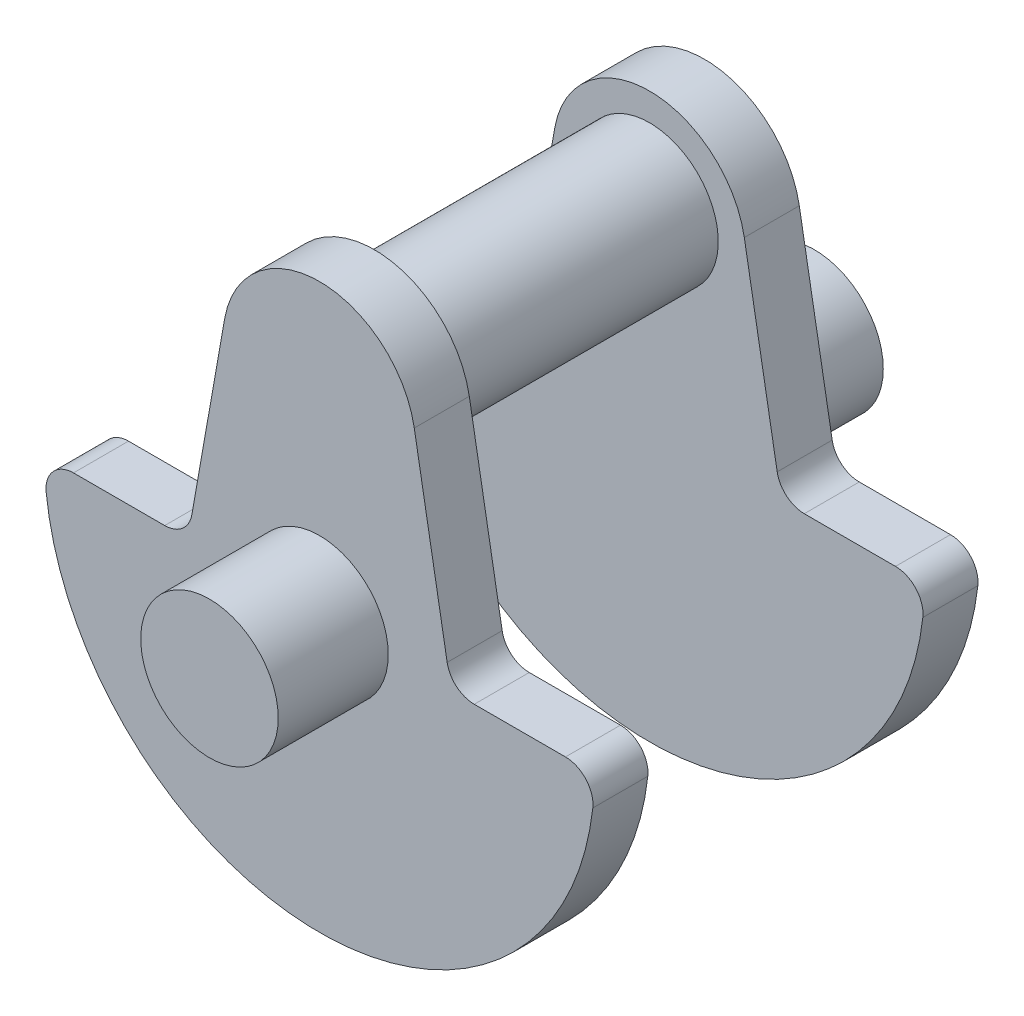
ISO-10303-21;
HEADER;
FILE_DESCRIPTION(('STEP AP214'),'2;1');
FILE_NAME('part.step','',(''),(''),'','','');
FILE_SCHEMA(('AUTOMOTIVE_DESIGN { 1 0 10303 214 1 1 1 1 }'));
ENDSEC;
DATA;
#1=APPLICATION_CONTEXT('core data for automotive mechanical design processes');
#2=APPLICATION_PROTOCOL_DEFINITION('international standard','automotive_design',2000,#1);
#3=PRODUCT_CONTEXT('',#1,'mechanical');
#4=PRODUCT('Part','Part','',(#3));
#5=PRODUCT_RELATED_PRODUCT_CATEGORY('part','',(#4));
#6=PRODUCT_DEFINITION_FORMATION('','',#4);
#7=PRODUCT_DEFINITION_CONTEXT('part definition',#1,'design');
#8=PRODUCT_DEFINITION('design','',#6,#7);
#9=PRODUCT_DEFINITION_SHAPE('','',#8);
#10=(LENGTH_UNIT() NAMED_UNIT(*) SI_UNIT(.MILLI.,.METRE.));
#11=(NAMED_UNIT(*) PLANE_ANGLE_UNIT() SI_UNIT($,.RADIAN.));
#12=(NAMED_UNIT(*) SI_UNIT($,.STERADIAN.) SOLID_ANGLE_UNIT());
#13=UNCERTAINTY_MEASURE_WITH_UNIT(LENGTH_MEASURE(1.E-05),#10,'distance_accuracy_value','');
#14=(GEOMETRIC_REPRESENTATION_CONTEXT(3) GLOBAL_UNCERTAINTY_ASSIGNED_CONTEXT((#13)) GLOBAL_UNIT_ASSIGNED_CONTEXT((#10,
#11,#12)) REPRESENTATION_CONTEXT('',''));
#15=CARTESIAN_POINT('',(0.,0.,0.));
#16=DIRECTION('',(0.,0.,1.));
#17=DIRECTION('',(1.,0.,0.));
#18=AXIS2_PLACEMENT_3D('',#15,#16,#17);
#19=CARTESIAN_POINT('',(0.,0.,10.));
#20=DIRECTION('',(0.,0.,-1.));
#21=DIRECTION('',(-1.,0.,0.));
#22=AXIS2_PLACEMENT_3D('',#19,#20,#21);
#23=PLANE('',#22);
#24=CARTESIAN_POINT('',(0.,0.,10.));
#25=DIRECTION('',(0.,0.,1.));
#26=DIRECTION('',(-1.,0.,0.));
#27=AXIS2_PLACEMENT_3D('',#24,#25,#26);
#28=CIRCLE('',#27,50.);
#29=CARTESIAN_POINT('',(-49.6903994999953,-5.55555555555555,10.));
#30=VERTEX_POINT('',#29);
#31=CARTESIAN_POINT('',(49.6903994999953,-5.55555555555555,10.));
#32=VERTEX_POINT('',#31);
#33=EDGE_CURVE('E230',#30,#32,#28,.T.);
#34=ORIENTED_EDGE('',*,*,#33,.T.);
#35=CARTESIAN_POINT('',(44.7213595499958,-5.,10.));
#36=DIRECTION('',(0.,0.,-1.));
#37=DIRECTION('',(-1.,0.,0.));
#38=AXIS2_PLACEMENT_3D('',#35,#36,#37);
#39=CIRCLE('',#38,5.);
#40=CARTESIAN_POINT('',(44.7213595499958,0.,10.));
#41=VERTEX_POINT('',#40);
#42=EDGE_CURVE('E286',#32,#41,#39,.F.);
#43=ORIENTED_EDGE('',*,*,#42,.T.);
#44=DIRECTION('',(-1.,0.,0.));
#45=VECTOR('',#44,1.);
#46=CARTESIAN_POINT('',(50.,0.,10.));
#47=LINE('',#46,#45);
#48=CARTESIAN_POINT('',(28.1369081886832,0.,10.));
#49=VERTEX_POINT('',#48);
#50=EDGE_CURVE('E233',#41,#49,#47,.T.);
#51=ORIENTED_EDGE('',*,*,#50,.T.);
#52=CARTESIAN_POINT('',(28.1369081886832,5.,10.));
#53=DIRECTION('',(0.,0.,-1.));
#54=DIRECTION('',(-1.,0.,0.));
#55=AXIS2_PLACEMENT_3D('',#52,#53,#54);
#56=CIRCLE('',#55,5.);
#57=CARTESIAN_POINT('',(23.2128694236222,4.13175911166535,10.));
#58=VERTEX_POINT('',#57);
#59=EDGE_CURVE('E297',#49,#58,#56,.T.);
#60=ORIENTED_EDGE('',*,*,#59,.T.);
#61=DIRECTION('',(-0.173648177666931,0.984807753012208,0.));
#62=VECTOR('',#61,1.);
#63=CARTESIAN_POINT('',(23.9414100327968,0.,10.));
#64=LINE('',#63,#62);
#65=CARTESIAN_POINT('',(17.2341356777136,38.0388431091713,10.));
#66=VERTEX_POINT('',#65);
#67=EDGE_CURVE('E237',#58,#66,#64,.T.);
#68=ORIENTED_EDGE('',*,*,#67,.T.);
#69=CARTESIAN_POINT('',(0.,35.,10.));
#70=DIRECTION('',(0.,0.,1.));
#71=DIRECTION('',(1.,0.,0.));
#72=AXIS2_PLACEMENT_3D('',#69,#70,#71);
#73=CIRCLE('',#72,17.5);
#74=CARTESIAN_POINT('',(-17.2341356777136,38.0388431091713,10.));
#75=VERTEX_POINT('',#74);
#76=EDGE_CURVE('E239',#66,#75,#73,.T.);
#77=ORIENTED_EDGE('',*,*,#76,.T.);
#78=DIRECTION('',(-0.173648177666931,-0.984807753012208,0.));
#79=VECTOR('',#78,1.);
#80=CARTESIAN_POINT('',(-23.9414100327968,0.,10.));
#81=LINE('',#80,#79);
#82=CARTESIAN_POINT('',(-23.2128694236222,4.13175911166535,10.));
#83=VERTEX_POINT('',#82);
#84=EDGE_CURVE('E241',#75,#83,#81,.T.);
#85=ORIENTED_EDGE('',*,*,#84,.T.);
#86=CARTESIAN_POINT('',(-28.1369081886832,5.,10.));
#87=DIRECTION('',(0.,0.,-1.));
#88=DIRECTION('',(-1.,0.,0.));
#89=AXIS2_PLACEMENT_3D('',#86,#87,#88);
#90=CIRCLE('',#89,5.);
#91=CARTESIAN_POINT('',(-28.1369081886832,0.,10.));
#92=VERTEX_POINT('',#91);
#93=EDGE_CURVE('E301',#83,#92,#90,.T.);
#94=ORIENTED_EDGE('',*,*,#93,.T.);
#95=DIRECTION('',(-1.,0.,0.));
#96=VECTOR('',#95,1.);
#97=CARTESIAN_POINT('',(-50.,0.,10.));
#98=LINE('',#97,#96);
#99=CARTESIAN_POINT('',(-44.7213595499958,0.,10.));
#100=VERTEX_POINT('',#99);
#101=EDGE_CURVE('E244',#92,#100,#98,.T.);
#102=ORIENTED_EDGE('',*,*,#101,.T.);
#103=CARTESIAN_POINT('',(-44.7213595499958,-5.,10.));
#104=DIRECTION('',(0.,0.,-1.));
#105=DIRECTION('',(-1.,0.,0.));
#106=AXIS2_PLACEMENT_3D('',#103,#104,#105);
#107=CIRCLE('',#106,5.);
#108=EDGE_CURVE('E284',#100,#30,#107,.F.);
#109=ORIENTED_EDGE('',*,*,#108,.T.);
#110=EDGE_LOOP('',(#34,#43,#51,#60,#68,#77,#85,#94,#102,#109));
#111=FACE_BOUND('',#110,.T.);
#112=CARTESIAN_POINT('',(0.,0.,10.));
#113=DIRECTION('',(0.,0.,1.));
#114=DIRECTION('',(1.,0.,0.));
#115=AXIS2_PLACEMENT_3D('',#112,#113,#114);
#116=CIRCLE('',#115,12.5);
#117=CARTESIAN_POINT('',(12.5,0.,10.));
#118=VERTEX_POINT('',#117);
#119=EDGE_CURVE('E226',#118,#118,#116,.T.);
#120=ORIENTED_EDGE('',*,*,#119,.F.);
#121=EDGE_LOOP('',(#120));
#122=FACE_BOUND('',#121,.T.);
#123=ADVANCED_FACE('F33',(#111,#122),#23,.F.);
#124=CARTESIAN_POINT('',(0.,0.,0.));
#125=DIRECTION('',(0.,0.,-1.));
#126=DIRECTION('',(-1.,0.,0.));
#127=AXIS2_PLACEMENT_3D('',#124,#125,#126);
#128=PLANE('',#127);
#129=CARTESIAN_POINT('',(0.,35.,0.));
#130=DIRECTION('',(0.,0.,-1.));
#131=DIRECTION('',(-1.,0.,0.));
#132=AXIS2_PLACEMENT_3D('',#129,#130,#131);
#133=CIRCLE('',#132,12.5);
#134=CARTESIAN_POINT('',(-12.5,35.,0.));
#135=VERTEX_POINT('',#134);
#136=EDGE_CURVE('E180',#135,#135,#133,.T.);
#137=ORIENTED_EDGE('',*,*,#136,.F.);
#138=EDGE_LOOP('',(#137));
#139=FACE_BOUND('',#138,.T.);
#140=DIRECTION('',(-1.,0.,0.));
#141=VECTOR('',#140,1.);
#142=CARTESIAN_POINT('',(50.,0.,0.));
#143=LINE('',#142,#141);
#144=CARTESIAN_POINT('',(44.7213595499958,0.,0.));
#145=VERTEX_POINT('',#144);
#146=CARTESIAN_POINT('',(28.1369081886832,0.,0.));
#147=VERTEX_POINT('',#146);
#148=EDGE_CURVE('E250',#145,#147,#143,.T.);
#149=ORIENTED_EDGE('',*,*,#148,.F.);
#150=CARTESIAN_POINT('',(44.7213595499958,-5.,0.));
#151=DIRECTION('',(0.,0.,-1.));
#152=DIRECTION('',(-1.,0.,0.));
#153=AXIS2_PLACEMENT_3D('',#150,#151,#152);
#154=CIRCLE('',#153,5.);
#155=CARTESIAN_POINT('',(49.6903994999953,-5.55555555555555,0.));
#156=VERTEX_POINT('',#155);
#157=EDGE_CURVE('E277',#145,#156,#154,.T.);
#158=ORIENTED_EDGE('',*,*,#157,.T.);
#159=CARTESIAN_POINT('',(0.,0.,0.));
#160=DIRECTION('',(0.,0.,1.));
#161=DIRECTION('',(-1.,0.,0.));
#162=AXIS2_PLACEMENT_3D('',#159,#160,#161);
#163=CIRCLE('',#162,50.);
#164=CARTESIAN_POINT('',(-49.6903994999953,-5.55555555555555,0.));
#165=VERTEX_POINT('',#164);
#166=EDGE_CURVE('E229',#165,#156,#163,.T.);
#167=ORIENTED_EDGE('',*,*,#166,.F.);
#168=CARTESIAN_POINT('',(-44.7213595499958,-5.,0.));
#169=DIRECTION('',(0.,0.,-1.));
#170=DIRECTION('',(-1.,0.,0.));
#171=AXIS2_PLACEMENT_3D('',#168,#169,#170);
#172=CIRCLE('',#171,5.);
#173=CARTESIAN_POINT('',(-44.7213595499958,0.,0.));
#174=VERTEX_POINT('',#173);
#175=EDGE_CURVE('E275',#165,#174,#172,.T.);
#176=ORIENTED_EDGE('',*,*,#175,.T.);
#177=DIRECTION('',(-1.,0.,0.));
#178=VECTOR('',#177,1.);
#179=CARTESIAN_POINT('',(-50.,0.,0.));
#180=LINE('',#179,#178);
#181=CARTESIAN_POINT('',(-28.1369081886832,0.,0.));
#182=VERTEX_POINT('',#181);
#183=EDGE_CURVE('E234',#182,#174,#180,.T.);
#184=ORIENTED_EDGE('',*,*,#183,.F.);
#185=CARTESIAN_POINT('',(-28.1369081886832,5.,0.));
#186=DIRECTION('',(0.,0.,-1.));
#187=DIRECTION('',(-1.,0.,0.));
#188=AXIS2_PLACEMENT_3D('',#185,#186,#187);
#189=CIRCLE('',#188,5.);
#190=CARTESIAN_POINT('',(-23.2128694236222,4.13175911166535,0.));
#191=VERTEX_POINT('',#190);
#192=EDGE_CURVE('E299',#182,#191,#189,.F.);
#193=ORIENTED_EDGE('',*,*,#192,.T.);
#194=DIRECTION('',(-0.173648177666931,-0.984807753012208,0.));
#195=VECTOR('',#194,1.);
#196=CARTESIAN_POINT('',(-23.9414100327968,0.,0.));
#197=LINE('',#196,#195);
#198=CARTESIAN_POINT('',(-17.2341356777136,38.0388431091713,0.));
#199=VERTEX_POINT('',#198);
#200=EDGE_CURVE('E257',#199,#191,#197,.T.);
#201=ORIENTED_EDGE('',*,*,#200,.F.);
#202=CARTESIAN_POINT('',(0.,35.,0.));
#203=DIRECTION('',(0.,0.,1.));
#204=DIRECTION('',(1.,0.,0.));
#205=AXIS2_PLACEMENT_3D('',#202,#203,#204);
#206=CIRCLE('',#205,17.5);
#207=CARTESIAN_POINT('',(17.2341356777136,38.0388431091713,0.));
#208=VERTEX_POINT('',#207);
#209=EDGE_CURVE('E255',#208,#199,#206,.T.);
#210=ORIENTED_EDGE('',*,*,#209,.F.);
#211=DIRECTION('',(-0.173648177666931,0.984807753012208,0.));
#212=VECTOR('',#211,1.);
#213=CARTESIAN_POINT('',(23.9414100327968,0.,0.));
#214=LINE('',#213,#212);
#215=CARTESIAN_POINT('',(23.2128694236222,4.13175911166535,0.));
#216=VERTEX_POINT('',#215);
#217=EDGE_CURVE('E253',#216,#208,#214,.T.);
#218=ORIENTED_EDGE('',*,*,#217,.F.);
#219=CARTESIAN_POINT('',(28.1369081886832,5.,0.));
#220=DIRECTION('',(0.,0.,-1.));
#221=DIRECTION('',(-1.,0.,0.));
#222=AXIS2_PLACEMENT_3D('',#219,#220,#221);
#223=CIRCLE('',#222,5.);
#224=EDGE_CURVE('E295',#216,#147,#223,.F.);
#225=ORIENTED_EDGE('',*,*,#224,.T.);
#226=EDGE_LOOP('',(#149,#158,#167,#176,#184,#193,#201,#210,#218,#225));
#227=FACE_BOUND('',#226,.T.);
#228=ADVANCED_FACE('F353',(#139,#227),#128,.T.);
#229=CARTESIAN_POINT('',(0.,0.,10.));
#230=DIRECTION('',(0.,0.,-1.));
#231=DIRECTION('',(-1.,0.,0.));
#232=AXIS2_PLACEMENT_3D('',#229,#230,#231);
#233=CYLINDRICAL_SURFACE('',#232,50.);
#234=ORIENTED_EDGE('',*,*,#166,.T.);
#235=DIRECTION('',(0.,0.,-1.));
#236=VECTOR('',#235,1.);
#237=CARTESIAN_POINT('',(49.6903994999953,-5.55555555555556,10.));
#238=LINE('',#237,#236);
#239=EDGE_CURVE('E282',#156,#32,#238,.F.);
#240=ORIENTED_EDGE('',*,*,#239,.T.);
#241=ORIENTED_EDGE('',*,*,#33,.F.);
#242=DIRECTION('',(0.,0.,-1.));
#243=VECTOR('',#242,1.);
#244=CARTESIAN_POINT('',(-49.6903994999953,-5.55555555555556,10.));
#245=LINE('',#244,#243);
#246=EDGE_CURVE('E279',#30,#165,#245,.T.);
#247=ORIENTED_EDGE('',*,*,#246,.T.);
#248=EDGE_LOOP('',(#234,#240,#241,#247));
#249=FACE_BOUND('',#248,.T.);
#250=ADVANCED_FACE('F360',(#249),#233,.T.);
#251=CARTESIAN_POINT('',(50.,0.,10.));
#252=DIRECTION('',(0.,-1.,0.));
#253=DIRECTION('',(1.,0.,0.));
#254=AXIS2_PLACEMENT_3D('',#251,#252,#253);
#255=PLANE('',#254);
#256=ORIENTED_EDGE('',*,*,#148,.T.);
#257=DIRECTION('',(0.,0.,-1.));
#258=VECTOR('',#257,1.);
#259=CARTESIAN_POINT('',(28.1369081886832,0.,10.));
#260=LINE('',#259,#258);
#261=EDGE_CURVE('E273',#147,#49,#260,.F.);
#262=ORIENTED_EDGE('',*,*,#261,.T.);
#263=ORIENTED_EDGE('',*,*,#50,.F.);
#264=DIRECTION('',(0.,0.,-1.));
#265=VECTOR('',#264,1.);
#266=CARTESIAN_POINT('',(44.7213595499958,0.,10.));
#267=LINE('',#266,#265);
#268=EDGE_CURVE('E270',#41,#145,#267,.T.);
#269=ORIENTED_EDGE('',*,*,#268,.T.);
#270=EDGE_LOOP('',(#256,#262,#263,#269));
#271=FACE_BOUND('',#270,.T.);
#272=ADVANCED_FACE('F384',(#271),#255,.F.);
#273=CARTESIAN_POINT('',(23.9414100327968,0.,10.));
#274=DIRECTION('',(-0.984807753012208,-0.173648177666931,0.));
#275=DIRECTION('',(0.173648177666931,-0.984807753012208,0.));
#276=AXIS2_PLACEMENT_3D('',#273,#274,#275);
#277=PLANE('',#276);
#278=ORIENTED_EDGE('',*,*,#67,.F.);
#279=DIRECTION('',(0.,0.,-1.));
#280=VECTOR('',#279,1.);
#281=CARTESIAN_POINT('',(23.2128694236222,4.13175911166535,0.));
#282=LINE('',#281,#280);
#283=EDGE_CURVE('E267',#58,#216,#282,.T.);
#284=ORIENTED_EDGE('',*,*,#283,.T.);
#285=ORIENTED_EDGE('',*,*,#217,.T.);
#286=DIRECTION('',(0.,0.,-1.));
#287=VECTOR('',#286,1.);
#288=CARTESIAN_POINT('',(17.2341356777136,38.0388431091713,10.));
#289=LINE('',#288,#287);
#290=EDGE_CURVE('E264',#66,#208,#289,.T.);
#291=ORIENTED_EDGE('',*,*,#290,.F.);
#292=EDGE_LOOP('',(#278,#284,#285,#291));
#293=FACE_BOUND('',#292,.T.);
#294=ADVANCED_FACE('F380',(#293),#277,.F.);
#295=CARTESIAN_POINT('',(0.,35.,10.));
#296=DIRECTION('',(0.,0.,-1.));
#297=DIRECTION('',(-1.,0.,0.));
#298=AXIS2_PLACEMENT_3D('',#295,#296,#297);
#299=CYLINDRICAL_SURFACE('',#298,17.5);
#300=ORIENTED_EDGE('',*,*,#209,.T.);
#301=DIRECTION('',(0.,0.,-1.));
#302=VECTOR('',#301,1.);
#303=CARTESIAN_POINT('',(-17.2341356777136,38.0388431091713,10.));
#304=LINE('',#303,#302);
#305=EDGE_CURVE('E247',#75,#199,#304,.T.);
#306=ORIENTED_EDGE('',*,*,#305,.F.);
#307=ORIENTED_EDGE('',*,*,#76,.F.);
#308=ORIENTED_EDGE('',*,*,#290,.T.);
#309=EDGE_LOOP('',(#300,#306,#307,#308));
#310=FACE_BOUND('',#309,.T.);
#311=ADVANCED_FACE('F376',(#310),#299,.T.);
#312=CARTESIAN_POINT('',(-23.9414100327968,0.,10.));
#313=DIRECTION('',(0.984807753012208,-0.173648177666931,0.));
#314=DIRECTION('',(0.173648177666931,0.984807753012208,0.));
#315=AXIS2_PLACEMENT_3D('',#312,#313,#314);
#316=PLANE('',#315);
#317=ORIENTED_EDGE('',*,*,#200,.T.);
#318=DIRECTION('',(0.,0.,-1.));
#319=VECTOR('',#318,1.);
#320=CARTESIAN_POINT('',(-23.2128694236222,4.13175911166535,10.));
#321=LINE('',#320,#319);
#322=EDGE_CURVE('E293',#191,#83,#321,.F.);
#323=ORIENTED_EDGE('',*,*,#322,.T.);
#324=ORIENTED_EDGE('',*,*,#84,.F.);
#325=ORIENTED_EDGE('',*,*,#305,.T.);
#326=EDGE_LOOP('',(#317,#323,#324,#325));
#327=FACE_BOUND('',#326,.T.);
#328=ADVANCED_FACE('F372',(#327),#316,.F.);
#329=CARTESIAN_POINT('',(-50.,0.,10.));
#330=DIRECTION('',(0.,-1.,0.));
#331=DIRECTION('',(1.,0.,0.));
#332=AXIS2_PLACEMENT_3D('',#329,#330,#331);
#333=PLANE('',#332);
#334=ORIENTED_EDGE('',*,*,#183,.T.);
#335=DIRECTION('',(0.,0.,-1.));
#336=VECTOR('',#335,1.);
#337=CARTESIAN_POINT('',(-44.7213595499958,0.,10.));
#338=LINE('',#337,#336);
#339=EDGE_CURVE('E291',#174,#100,#338,.F.);
#340=ORIENTED_EDGE('',*,*,#339,.T.);
#341=ORIENTED_EDGE('',*,*,#101,.F.);
#342=DIRECTION('',(0.,0.,-1.));
#343=VECTOR('',#342,1.);
#344=CARTESIAN_POINT('',(-28.1369081886832,0.,0.));
#345=LINE('',#344,#343);
#346=EDGE_CURVE('E288',#92,#182,#345,.T.);
#347=ORIENTED_EDGE('',*,*,#346,.T.);
#348=EDGE_LOOP('',(#334,#340,#341,#347));
#349=FACE_BOUND('',#348,.T.);
#350=ADVANCED_FACE('F368',(#349),#333,.F.);
#351=CARTESIAN_POINT('',(28.1369081886832,5.,10.));
#352=DIRECTION('',(0.,0.,1.));
#353=DIRECTION('',(1.,0.,0.));
#354=AXIS2_PLACEMENT_3D('',#351,#352,#353);
#355=CYLINDRICAL_SURFACE('',#354,5.);
#356=ORIENTED_EDGE('',*,*,#59,.F.);
#357=ORIENTED_EDGE('',*,*,#261,.F.);
#358=ORIENTED_EDGE('',*,*,#224,.F.);
#359=ORIENTED_EDGE('',*,*,#283,.F.);
#360=EDGE_LOOP('',(#356,#357,#358,#359));
#361=FACE_BOUND('',#360,.T.);
#362=ADVANCED_FACE('F371',(#361),#355,.F.);
#363=CARTESIAN_POINT('',(44.7213595499958,-5.,10.));
#364=DIRECTION('',(0.,0.,-1.));
#365=DIRECTION('',(-1.,0.,0.));
#366=AXIS2_PLACEMENT_3D('',#363,#364,#365);
#367=CYLINDRICAL_SURFACE('',#366,5.);
#368=ORIENTED_EDGE('',*,*,#42,.F.);
#369=ORIENTED_EDGE('',*,*,#239,.F.);
#370=ORIENTED_EDGE('',*,*,#157,.F.);
#371=ORIENTED_EDGE('',*,*,#268,.F.);
#372=EDGE_LOOP('',(#368,#369,#370,#371));
#373=FACE_BOUND('',#372,.T.);
#374=ADVANCED_FACE('F393',(#373),#367,.T.);
#375=CARTESIAN_POINT('',(-44.7213595499958,-5.,10.));
#376=DIRECTION('',(0.,0.,-1.));
#377=DIRECTION('',(-1.,0.,0.));
#378=AXIS2_PLACEMENT_3D('',#375,#376,#377);
#379=CYLINDRICAL_SURFACE('',#378,5.);
#380=ORIENTED_EDGE('',*,*,#108,.F.);
#381=ORIENTED_EDGE('',*,*,#339,.F.);
#382=ORIENTED_EDGE('',*,*,#175,.F.);
#383=ORIENTED_EDGE('',*,*,#246,.F.);
#384=EDGE_LOOP('',(#380,#381,#382,#383));
#385=FACE_BOUND('',#384,.T.);
#386=ADVANCED_FACE('F397',(#385),#379,.T.);
#387=CARTESIAN_POINT('',(-28.1369081886832,5.,10.));
#388=DIRECTION('',(0.,0.,1.));
#389=DIRECTION('',(1.,0.,0.));
#390=AXIS2_PLACEMENT_3D('',#387,#388,#389);
#391=CYLINDRICAL_SURFACE('',#390,5.);
#392=ORIENTED_EDGE('',*,*,#93,.F.);
#393=ORIENTED_EDGE('',*,*,#322,.F.);
#394=ORIENTED_EDGE('',*,*,#192,.F.);
#395=ORIENTED_EDGE('',*,*,#346,.F.);
#396=EDGE_LOOP('',(#392,#393,#394,#395));
#397=FACE_BOUND('',#396,.T.);
#398=ADVANCED_FACE('F401',(#397),#391,.F.);
#399=CARTESIAN_POINT('',(0.,0.,30.));
#400=DIRECTION('',(0.,0.,-1.));
#401=DIRECTION('',(-1.,0.,0.));
#402=AXIS2_PLACEMENT_3D('',#399,#400,#401);
#403=CYLINDRICAL_SURFACE('',#402,12.5);
#404=CARTESIAN_POINT('',(0.,0.,30.));
#405=DIRECTION('',(0.,0.,1.));
#406=DIRECTION('',(1.,0.,0.));
#407=AXIS2_PLACEMENT_3D('',#404,#405,#406);
#408=CIRCLE('',#407,12.5);
#409=CARTESIAN_POINT('',(12.5,0.,30.));
#410=VERTEX_POINT('',#409);
#411=EDGE_CURVE('E221',#410,#410,#408,.T.);
#412=ORIENTED_EDGE('',*,*,#411,.F.);
#413=EDGE_LOOP('',(#412));
#414=FACE_BOUND('',#413,.T.);
#415=ORIENTED_EDGE('',*,*,#119,.T.);
#416=EDGE_LOOP('',(#415));
#417=FACE_BOUND('',#416,.T.);
#418=ADVANCED_FACE('F365',(#414,#417),#403,.T.);
#419=CARTESIAN_POINT('',(0.,0.,30.));
#420=DIRECTION('',(0.,0.,1.));
#421=DIRECTION('',(1.,0.,0.));
#422=AXIS2_PLACEMENT_3D('',#419,#420,#421);
#423=PLANE('',#422);
#424=ORIENTED_EDGE('',*,*,#411,.T.);
#425=EDGE_LOOP('',(#424));
#426=FACE_BOUND('',#425,.T.);
#427=ADVANCED_FACE('F460',(#426),#423,.T.);
#428=CARTESIAN_POINT('',(0.,35.,-50.));
#429=DIRECTION('',(0.,0.,1.));
#430=DIRECTION('',(1.,0.,0.));
#431=AXIS2_PLACEMENT_3D('',#428,#429,#430);
#432=CYLINDRICAL_SURFACE('',#431,12.5);
#433=CARTESIAN_POINT('',(0.,35.,-50.));
#434=DIRECTION('',(0.,0.,-1.));
#435=DIRECTION('',(-1.,0.,0.));
#436=AXIS2_PLACEMENT_3D('',#433,#434,#435);
#437=CIRCLE('',#436,12.5);
#438=CARTESIAN_POINT('',(-12.5,35.,-50.));
#439=VERTEX_POINT('',#438);
#440=EDGE_CURVE('E218',#439,#439,#437,.T.);
#441=ORIENTED_EDGE('',*,*,#440,.F.);
#442=EDGE_LOOP('',(#441));
#443=FACE_BOUND('',#442,.T.);
#444=ORIENTED_EDGE('',*,*,#136,.T.);
#445=EDGE_LOOP('',(#444));
#446=FACE_BOUND('',#445,.T.);
#447=ADVANCED_FACE('F458',(#443,#446),#432,.T.);
#448=CARTESIAN_POINT('',(0.,0.,-60.));
#449=DIRECTION('',(0.,0.,1.));
#450=DIRECTION('',(1.,0.,0.));
#451=AXIS2_PLACEMENT_3D('',#448,#449,#450);
#452=CYLINDRICAL_SURFACE('',#451,50.);
#453=CARTESIAN_POINT('',(0.,0.,-60.));
#454=DIRECTION('',(0.,0.,1.));
#455=DIRECTION('',(-1.,0.,0.));
#456=AXIS2_PLACEMENT_3D('',#453,#454,#455);
#457=CIRCLE('',#456,50.);
#458=CARTESIAN_POINT('',(-49.6903994999953,-5.55555555555555,-60.));
#459=VERTEX_POINT('',#458);
#460=CARTESIAN_POINT('',(49.6903994999953,-5.55555555555555,-60.));
#461=VERTEX_POINT('',#460);
#462=EDGE_CURVE('E216',#459,#461,#457,.T.);
#463=ORIENTED_EDGE('',*,*,#462,.T.);
#464=DIRECTION('',(0.,0.,1.));
#465=VECTOR('',#464,1.);
#466=CARTESIAN_POINT('',(49.6903994999953,-5.55555555555556,-60.));
#467=LINE('',#466,#465);
#468=CARTESIAN_POINT('',(49.6903994999953,-5.55555555555555,-50.));
#469=VERTEX_POINT('',#468);
#470=EDGE_CURVE('E312',#461,#469,#467,.T.);
#471=ORIENTED_EDGE('',*,*,#470,.T.);
#472=CARTESIAN_POINT('',(0.,0.,-50.));
#473=DIRECTION('',(0.,0.,1.));
#474=DIRECTION('',(-1.,0.,0.));
#475=AXIS2_PLACEMENT_3D('',#472,#473,#474);
#476=CIRCLE('',#475,50.);
#477=CARTESIAN_POINT('',(-49.6903994999953,-5.55555555555555,-50.));
#478=VERTEX_POINT('',#477);
#479=EDGE_CURVE('E201',#478,#469,#476,.T.);
#480=ORIENTED_EDGE('',*,*,#479,.F.);
#481=DIRECTION('',(0.,0.,1.));
#482=VECTOR('',#481,1.);
#483=CARTESIAN_POINT('',(-49.6903994999953,-5.55555555555556,-60.));
#484=LINE('',#483,#482);
#485=EDGE_CURVE('E310',#478,#459,#484,.F.);
#486=ORIENTED_EDGE('',*,*,#485,.T.);
#487=EDGE_LOOP('',(#463,#471,#480,#486));
#488=FACE_BOUND('',#487,.T.);
#489=ADVANCED_FACE('F419',(#488),#452,.T.);
#490=CARTESIAN_POINT('',(-50.,0.,-60.));
#491=DIRECTION('',(0.,1.,0.));
#492=DIRECTION('',(-1.,0.,0.));
#493=AXIS2_PLACEMENT_3D('',#490,#491,#492);
#494=PLANE('',#493);
#495=DIRECTION('',(-1.,0.,0.));
#496=VECTOR('',#495,1.);
#497=CARTESIAN_POINT('',(-50.,0.,-60.));
#498=LINE('',#497,#496);
#499=CARTESIAN_POINT('',(-28.1369081886832,0.,-60.));
#500=VERTEX_POINT('',#499);
#501=CARTESIAN_POINT('',(-44.7213595499958,0.,-60.));
#502=VERTEX_POINT('',#501);
#503=EDGE_CURVE('E188',#500,#502,#498,.T.);
#504=ORIENTED_EDGE('',*,*,#503,.T.);
#505=DIRECTION('',(0.,0.,1.));
#506=VECTOR('',#505,1.);
#507=CARTESIAN_POINT('',(-44.7213595499958,0.,-60.));
#508=LINE('',#507,#506);
#509=CARTESIAN_POINT('',(-44.7213595499958,0.,-50.));
#510=VERTEX_POINT('',#509);
#511=EDGE_CURVE('E324',#502,#510,#508,.T.);
#512=ORIENTED_EDGE('',*,*,#511,.T.);
#513=DIRECTION('',(-1.,0.,0.));
#514=VECTOR('',#513,1.);
#515=CARTESIAN_POINT('',(-50.,0.,-50.));
#516=LINE('',#515,#514);
#517=CARTESIAN_POINT('',(-28.1369081886832,0.,-50.));
#518=VERTEX_POINT('',#517);
#519=EDGE_CURVE('E204',#518,#510,#516,.T.);
#520=ORIENTED_EDGE('',*,*,#519,.F.);
#521=DIRECTION('',(0.,0.,1.));
#522=VECTOR('',#521,1.);
#523=CARTESIAN_POINT('',(-28.1369081886832,0.,-60.));
#524=LINE('',#523,#522);
#525=EDGE_CURVE('E322',#518,#500,#524,.F.);
#526=ORIENTED_EDGE('',*,*,#525,.T.);
#527=EDGE_LOOP('',(#504,#512,#520,#526));
#528=FACE_BOUND('',#527,.T.);
#529=ADVANCED_FACE('F338',(#528),#494,.T.);
#530=CARTESIAN_POINT('',(-23.9414100327968,0.,-60.));
#531=DIRECTION('',(-0.984807753012208,0.173648177666931,0.));
#532=DIRECTION('',(-0.173648177666931,-0.984807753012208,0.));
#533=AXIS2_PLACEMENT_3D('',#530,#531,#532);
#534=PLANE('',#533);
#535=DIRECTION('',(-0.173648177666931,-0.984807753012208,0.));
#536=VECTOR('',#535,1.);
#537=CARTESIAN_POINT('',(-23.9414100327968,0.,-60.));
#538=LINE('',#537,#536);
#539=CARTESIAN_POINT('',(-17.2341356777136,38.0388431091713,-60.));
#540=VERTEX_POINT('',#539);
#541=CARTESIAN_POINT('',(-23.2128694236222,4.13175911166535,-60.));
#542=VERTEX_POINT('',#541);
#543=EDGE_CURVE('E172',#540,#542,#538,.T.);
#544=ORIENTED_EDGE('',*,*,#543,.T.);
#545=DIRECTION('',(0.,0.,1.));
#546=VECTOR('',#545,1.);
#547=CARTESIAN_POINT('',(-23.2128694236222,4.13175911166535,-50.));
#548=LINE('',#547,#546);
#549=CARTESIAN_POINT('',(-23.2128694236222,4.13175911166535,-50.));
#550=VERTEX_POINT('',#549);
#551=EDGE_CURVE('E327',#542,#550,#548,.T.);
#552=ORIENTED_EDGE('',*,*,#551,.T.);
#553=DIRECTION('',(-0.173648177666931,-0.984807753012208,0.));
#554=VECTOR('',#553,1.);
#555=CARTESIAN_POINT('',(-23.9414100327968,0.,-50.));
#556=LINE('',#555,#554);
#557=CARTESIAN_POINT('',(-17.2341356777136,38.0388431091713,-50.));
#558=VERTEX_POINT('',#557);
#559=EDGE_CURVE('E175',#558,#550,#556,.T.);
#560=ORIENTED_EDGE('',*,*,#559,.F.);
#561=DIRECTION('',(0.,0.,1.));
#562=VECTOR('',#561,1.);
#563=CARTESIAN_POINT('',(-17.2341356777136,38.0388431091713,-60.));
#564=LINE('',#563,#562);
#565=EDGE_CURVE('E169',#540,#558,#564,.T.);
#566=ORIENTED_EDGE('',*,*,#565,.F.);
#567=EDGE_LOOP('',(#544,#552,#560,#566));
#568=FACE_BOUND('',#567,.T.);
#569=ADVANCED_FACE('F170',(#568),#534,.T.);
#570=CARTESIAN_POINT('',(0.,35.,-60.));
#571=DIRECTION('',(0.,0.,1.));
#572=DIRECTION('',(1.,0.,0.));
#573=AXIS2_PLACEMENT_3D('',#570,#571,#572);
#574=CYLINDRICAL_SURFACE('',#573,17.5);
#575=CARTESIAN_POINT('',(0.,35.,-50.));
#576=DIRECTION('',(0.,0.,1.));
#577=DIRECTION('',(1.,0.,0.));
#578=AXIS2_PLACEMENT_3D('',#575,#576,#577);
#579=CIRCLE('',#578,17.5);
#580=CARTESIAN_POINT('',(17.2341356777136,38.0388431091713,-50.));
#581=VERTEX_POINT('',#580);
#582=EDGE_CURVE('E209',#581,#558,#579,.T.);
#583=ORIENTED_EDGE('',*,*,#582,.F.);
#584=DIRECTION('',(0.,0.,1.));
#585=VECTOR('',#584,1.);
#586=CARTESIAN_POINT('',(17.2341356777136,38.0388431091713,-60.));
#587=LINE('',#586,#585);
#588=CARTESIAN_POINT('',(17.2341356777136,38.0388431091713,-60.));
#589=VERTEX_POINT('',#588);
#590=EDGE_CURVE('E181',#589,#581,#587,.T.);
#591=ORIENTED_EDGE('',*,*,#590,.F.);
#592=CARTESIAN_POINT('',(0.,35.,-60.));
#593=DIRECTION('',(0.,0.,1.));
#594=DIRECTION('',(1.,0.,0.));
#595=AXIS2_PLACEMENT_3D('',#592,#593,#594);
#596=CIRCLE('',#595,17.5);
#597=EDGE_CURVE('E187',#589,#540,#596,.T.);
#598=ORIENTED_EDGE('',*,*,#597,.T.);
#599=ORIENTED_EDGE('',*,*,#565,.T.);
#600=EDGE_LOOP('',(#583,#591,#598,#599));
#601=FACE_BOUND('',#600,.T.);
#602=ADVANCED_FACE('F191',(#601),#574,.T.);
#603=CARTESIAN_POINT('',(23.9414100327968,0.,-60.));
#604=DIRECTION('',(0.984807753012208,0.173648177666931,0.));
#605=DIRECTION('',(-0.173648177666931,0.984807753012208,0.));
#606=AXIS2_PLACEMENT_3D('',#603,#604,#605);
#607=PLANE('',#606);
#608=DIRECTION('',(-0.173648177666931,0.984807753012208,0.));
#609=VECTOR('',#608,1.);
#610=CARTESIAN_POINT('',(23.9414100327968,0.,-50.));
#611=LINE('',#610,#609);
#612=CARTESIAN_POINT('',(23.2128694236222,4.13175911166535,-50.));
#613=VERTEX_POINT('',#612);
#614=EDGE_CURVE('E211',#613,#581,#611,.T.);
#615=ORIENTED_EDGE('',*,*,#614,.F.);
#616=DIRECTION('',(0.,0.,1.));
#617=VECTOR('',#616,1.);
#618=CARTESIAN_POINT('',(23.2128694236222,4.13175911166535,-60.));
#619=LINE('',#618,#617);
#620=CARTESIAN_POINT('',(23.2128694236222,4.13175911166535,-60.));
#621=VERTEX_POINT('',#620);
#622=EDGE_CURVE('E308',#613,#621,#619,.F.);
#623=ORIENTED_EDGE('',*,*,#622,.T.);
#624=DIRECTION('',(-0.173648177666931,0.984807753012208,0.));
#625=VECTOR('',#624,1.);
#626=CARTESIAN_POINT('',(23.9414100327968,0.,-60.));
#627=LINE('',#626,#625);
#628=EDGE_CURVE('E193',#621,#589,#627,.T.);
#629=ORIENTED_EDGE('',*,*,#628,.T.);
#630=ORIENTED_EDGE('',*,*,#590,.T.);
#631=EDGE_LOOP('',(#615,#623,#629,#630));
#632=FACE_BOUND('',#631,.T.);
#633=ADVANCED_FACE('F445',(#632),#607,.T.);
#634=CARTESIAN_POINT('',(50.,0.,-60.));
#635=DIRECTION('',(0.,1.,0.));
#636=DIRECTION('',(-1.,0.,0.));
#637=AXIS2_PLACEMENT_3D('',#634,#635,#636);
#638=PLANE('',#637);
#639=DIRECTION('',(-1.,0.,0.));
#640=VECTOR('',#639,1.);
#641=CARTESIAN_POINT('',(50.,0.,-60.));
#642=LINE('',#641,#640);
#643=CARTESIAN_POINT('',(44.7213595499958,0.,-60.));
#644=VERTEX_POINT('',#643);
#645=CARTESIAN_POINT('',(28.1369081886832,0.,-60.));
#646=VERTEX_POINT('',#645);
#647=EDGE_CURVE('E195',#644,#646,#642,.T.);
#648=ORIENTED_EDGE('',*,*,#647,.T.);
#649=DIRECTION('',(0.,0.,1.));
#650=VECTOR('',#649,1.);
#651=CARTESIAN_POINT('',(28.1369081886832,0.,-50.));
#652=LINE('',#651,#650);
#653=CARTESIAN_POINT('',(28.1369081886832,0.,-50.));
#654=VERTEX_POINT('',#653);
#655=EDGE_CURVE('E305',#646,#654,#652,.T.);
#656=ORIENTED_EDGE('',*,*,#655,.T.);
#657=DIRECTION('',(-1.,0.,0.));
#658=VECTOR('',#657,1.);
#659=CARTESIAN_POINT('',(50.,0.,-50.));
#660=LINE('',#659,#658);
#661=CARTESIAN_POINT('',(44.7213595499958,0.,-50.));
#662=VERTEX_POINT('',#661);
#663=EDGE_CURVE('E213',#662,#654,#660,.T.);
#664=ORIENTED_EDGE('',*,*,#663,.F.);
#665=DIRECTION('',(0.,0.,1.));
#666=VECTOR('',#665,1.);
#667=CARTESIAN_POINT('',(44.7213595499958,0.,-60.));
#668=LINE('',#667,#666);
#669=EDGE_CURVE('E303',#662,#644,#668,.F.);
#670=ORIENTED_EDGE('',*,*,#669,.T.);
#671=EDGE_LOOP('',(#648,#656,#664,#670));
#672=FACE_BOUND('',#671,.T.);
#673=ADVANCED_FACE('F438',(#672),#638,.T.);
#674=CARTESIAN_POINT('',(0.,0.,-60.));
#675=DIRECTION('',(0.,0.,1.));
#676=DIRECTION('',(-1.,0.,0.));
#677=AXIS2_PLACEMENT_3D('',#674,#675,#676);
#678=PLANE('',#677);
#679=CARTESIAN_POINT('',(0.,0.,-60.));
#680=DIRECTION('',(0.,0.,1.));
#681=DIRECTION('',(1.,0.,0.));
#682=AXIS2_PLACEMENT_3D('',#679,#680,#681);
#683=CIRCLE('',#682,12.5);
#684=CARTESIAN_POINT('',(12.5,0.,-60.));
#685=VERTEX_POINT('',#684);
#686=EDGE_CURVE('E205',#685,#685,#683,.T.);
#687=ORIENTED_EDGE('',*,*,#686,.T.);
#688=EDGE_LOOP('',(#687));
#689=FACE_BOUND('',#688,.T.);
#690=ORIENTED_EDGE('',*,*,#647,.F.);
#691=CARTESIAN_POINT('',(44.7213595499958,-5.,-60.));
#692=DIRECTION('',(0.,0.,1.));
#693=DIRECTION('',(1.,0.,0.));
#694=AXIS2_PLACEMENT_3D('',#691,#692,#693);
#695=CIRCLE('',#694,5.);
#696=EDGE_CURVE('E320',#644,#461,#695,.F.);
#697=ORIENTED_EDGE('',*,*,#696,.T.);
#698=ORIENTED_EDGE('',*,*,#462,.F.);
#699=CARTESIAN_POINT('',(-44.7213595499958,-5.,-60.));
#700=DIRECTION('',(0.,0.,1.));
#701=DIRECTION('',(1.,0.,0.));
#702=AXIS2_PLACEMENT_3D('',#699,#700,#701);
#703=CIRCLE('',#702,5.);
#704=EDGE_CURVE('E52',#459,#502,#703,.F.);
#705=ORIENTED_EDGE('',*,*,#704,.T.);
#706=ORIENTED_EDGE('',*,*,#503,.F.);
#707=CARTESIAN_POINT('',(-28.1369081886832,5.,-60.));
#708=DIRECTION('',(0.,0.,1.));
#709=DIRECTION('',(1.,0.,0.));
#710=AXIS2_PLACEMENT_3D('',#707,#708,#709);
#711=CIRCLE('',#710,5.);
#712=EDGE_CURVE('E11',#500,#542,#711,.T.);
#713=ORIENTED_EDGE('',*,*,#712,.T.);
#714=ORIENTED_EDGE('',*,*,#543,.F.);
#715=ORIENTED_EDGE('',*,*,#597,.F.);
#716=ORIENTED_EDGE('',*,*,#628,.F.);
#717=CARTESIAN_POINT('',(28.1369081886832,5.,-60.));
#718=DIRECTION('',(0.,0.,1.));
#719=DIRECTION('',(1.,0.,0.));
#720=AXIS2_PLACEMENT_3D('',#717,#718,#719);
#721=CIRCLE('',#720,5.);
#722=EDGE_CURVE('E331',#621,#646,#721,.T.);
#723=ORIENTED_EDGE('',*,*,#722,.T.);
#724=EDGE_LOOP('',(#690,#697,#698,#705,#706,#713,#714,#715,#716,#723));
#725=FACE_BOUND('',#724,.T.);
#726=ADVANCED_FACE('F185',(#689,#725),#678,.F.);
#727=CARTESIAN_POINT('',(0.,0.,-50.));
#728=DIRECTION('',(0.,0.,1.));
#729=DIRECTION('',(-1.,0.,0.));
#730=AXIS2_PLACEMENT_3D('',#727,#728,#729);
#731=PLANE('',#730);
#732=ORIENTED_EDGE('',*,*,#440,.T.);
#733=EDGE_LOOP('',(#732));
#734=FACE_BOUND('',#733,.T.);
#735=ORIENTED_EDGE('',*,*,#479,.T.);
#736=CARTESIAN_POINT('',(44.7213595499958,-5.,-50.));
#737=DIRECTION('',(0.,0.,1.));
#738=DIRECTION('',(1.,0.,0.));
#739=AXIS2_PLACEMENT_3D('',#736,#737,#738);
#740=CIRCLE('',#739,5.);
#741=EDGE_CURVE('E317',#469,#662,#740,.T.);
#742=ORIENTED_EDGE('',*,*,#741,.T.);
#743=ORIENTED_EDGE('',*,*,#663,.T.);
#744=CARTESIAN_POINT('',(28.1369081886832,5.,-50.));
#745=DIRECTION('',(0.,0.,1.));
#746=DIRECTION('',(1.,0.,0.));
#747=AXIS2_PLACEMENT_3D('',#744,#745,#746);
#748=CIRCLE('',#747,5.);
#749=EDGE_CURVE('E329',#654,#613,#748,.F.);
#750=ORIENTED_EDGE('',*,*,#749,.T.);
#751=ORIENTED_EDGE('',*,*,#614,.T.);
#752=ORIENTED_EDGE('',*,*,#582,.T.);
#753=ORIENTED_EDGE('',*,*,#559,.T.);
#754=CARTESIAN_POINT('',(-28.1369081886832,5.,-50.));
#755=DIRECTION('',(0.,0.,1.));
#756=DIRECTION('',(1.,0.,0.));
#757=AXIS2_PLACEMENT_3D('',#754,#755,#756);
#758=CIRCLE('',#757,5.);
#759=EDGE_CURVE('E41',#550,#518,#758,.F.);
#760=ORIENTED_EDGE('',*,*,#759,.T.);
#761=ORIENTED_EDGE('',*,*,#519,.T.);
#762=CARTESIAN_POINT('',(-44.7213595499958,-5.,-50.));
#763=DIRECTION('',(0.,0.,1.));
#764=DIRECTION('',(1.,0.,0.));
#765=AXIS2_PLACEMENT_3D('',#762,#763,#764);
#766=CIRCLE('',#765,5.);
#767=EDGE_CURVE('E315',#510,#478,#766,.T.);
#768=ORIENTED_EDGE('',*,*,#767,.T.);
#769=EDGE_LOOP('',(#735,#742,#743,#750,#751,#752,#753,#760,#761,#768));
#770=FACE_BOUND('',#769,.T.);
#771=ADVANCED_FACE('F334',(#734,#770),#731,.T.);
#772=CARTESIAN_POINT('',(28.1369081886832,5.,-60.));
#773=DIRECTION('',(0.,0.,-1.));
#774=DIRECTION('',(-1.,0.,0.));
#775=AXIS2_PLACEMENT_3D('',#772,#773,#774);
#776=CYLINDRICAL_SURFACE('',#775,5.);
#777=ORIENTED_EDGE('',*,*,#722,.F.);
#778=ORIENTED_EDGE('',*,*,#622,.F.);
#779=ORIENTED_EDGE('',*,*,#749,.F.);
#780=ORIENTED_EDGE('',*,*,#655,.F.);
#781=EDGE_LOOP('',(#777,#778,#779,#780));
#782=FACE_BOUND('',#781,.T.);
#783=ADVANCED_FACE('F406',(#782),#776,.F.);
#784=CARTESIAN_POINT('',(44.7213595499958,-5.,-60.));
#785=DIRECTION('',(0.,0.,1.));
#786=DIRECTION('',(1.,0.,0.));
#787=AXIS2_PLACEMENT_3D('',#784,#785,#786);
#788=CYLINDRICAL_SURFACE('',#787,5.);
#789=ORIENTED_EDGE('',*,*,#696,.F.);
#790=ORIENTED_EDGE('',*,*,#669,.F.);
#791=ORIENTED_EDGE('',*,*,#741,.F.);
#792=ORIENTED_EDGE('',*,*,#470,.F.);
#793=EDGE_LOOP('',(#789,#790,#791,#792));
#794=FACE_BOUND('',#793,.T.);
#795=ADVANCED_FACE('F350',(#794),#788,.T.);
#796=CARTESIAN_POINT('',(-44.7213595499958,-5.,-60.));
#797=DIRECTION('',(0.,0.,1.));
#798=DIRECTION('',(1.,0.,0.));
#799=AXIS2_PLACEMENT_3D('',#796,#797,#798);
#800=CYLINDRICAL_SURFACE('',#799,5.);
#801=ORIENTED_EDGE('',*,*,#704,.F.);
#802=ORIENTED_EDGE('',*,*,#485,.F.);
#803=ORIENTED_EDGE('',*,*,#767,.F.);
#804=ORIENTED_EDGE('',*,*,#511,.F.);
#805=EDGE_LOOP('',(#801,#802,#803,#804));
#806=FACE_BOUND('',#805,.T.);
#807=ADVANCED_FACE('F342',(#806),#800,.T.);
#808=CARTESIAN_POINT('',(-28.1369081886832,5.,-60.));
#809=DIRECTION('',(0.,0.,-1.));
#810=DIRECTION('',(-1.,0.,0.));
#811=AXIS2_PLACEMENT_3D('',#808,#809,#810);
#812=CYLINDRICAL_SURFACE('',#811,5.);
#813=ORIENTED_EDGE('',*,*,#712,.F.);
#814=ORIENTED_EDGE('',*,*,#525,.F.);
#815=ORIENTED_EDGE('',*,*,#759,.F.);
#816=ORIENTED_EDGE('',*,*,#551,.F.);
#817=EDGE_LOOP('',(#813,#814,#815,#816));
#818=FACE_BOUND('',#817,.T.);
#819=ADVANCED_FACE('F35',(#818),#812,.F.);
#820=CARTESIAN_POINT('',(0.,0.,-80.));
#821=DIRECTION('',(0.,0.,1.));
#822=DIRECTION('',(1.,0.,0.));
#823=AXIS2_PLACEMENT_3D('',#820,#821,#822);
#824=CYLINDRICAL_SURFACE('',#823,12.5);
#825=CARTESIAN_POINT('',(0.,0.,-80.));
#826=DIRECTION('',(0.,0.,1.));
#827=DIRECTION('',(1.,0.,0.));
#828=AXIS2_PLACEMENT_3D('',#825,#826,#827);
#829=CIRCLE('',#828,12.5);
#830=CARTESIAN_POINT('',(12.5,0.,-80.));
#831=VERTEX_POINT('',#830);
#832=EDGE_CURVE('E426',#831,#831,#829,.T.);
#833=ORIENTED_EDGE('',*,*,#832,.T.);
#834=EDGE_LOOP('',(#833));
#835=FACE_BOUND('',#834,.T.);
#836=ORIENTED_EDGE('',*,*,#686,.F.);
#837=EDGE_LOOP('',(#836));
#838=FACE_BOUND('',#837,.T.);
#839=ADVANCED_FACE('F341',(#835,#838),#824,.T.);
#840=CARTESIAN_POINT('',(0.,0.,-80.));
#841=DIRECTION('',(0.,0.,-1.));
#842=DIRECTION('',(1.,0.,0.));
#843=AXIS2_PLACEMENT_3D('',#840,#841,#842);
#844=PLANE('',#843);
#845=ORIENTED_EDGE('',*,*,#832,.F.);
#846=EDGE_LOOP('',(#845));
#847=FACE_BOUND('',#846,.T.);
#848=ADVANCED_FACE('F347',(#847),#844,.T.);
#849=CLOSED_SHELL('',(#123,#228,#250,#272,#294,#311,#328,#350,#362,#374,#386,#398,#418,#427,
#447,#489,#529,#569,#602,#633,#673,#726,#771,#783,#795,#807,#819,#839,#848));
#850=MANIFOLD_SOLID_BREP('B2',#849);
#851=ADVANCED_BREP_SHAPE_REPRESENTATION('',(#18,#850),#14);
#852=SHAPE_DEFINITION_REPRESENTATION(#9,#851);
ENDSEC;
END-ISO-10303-21;
